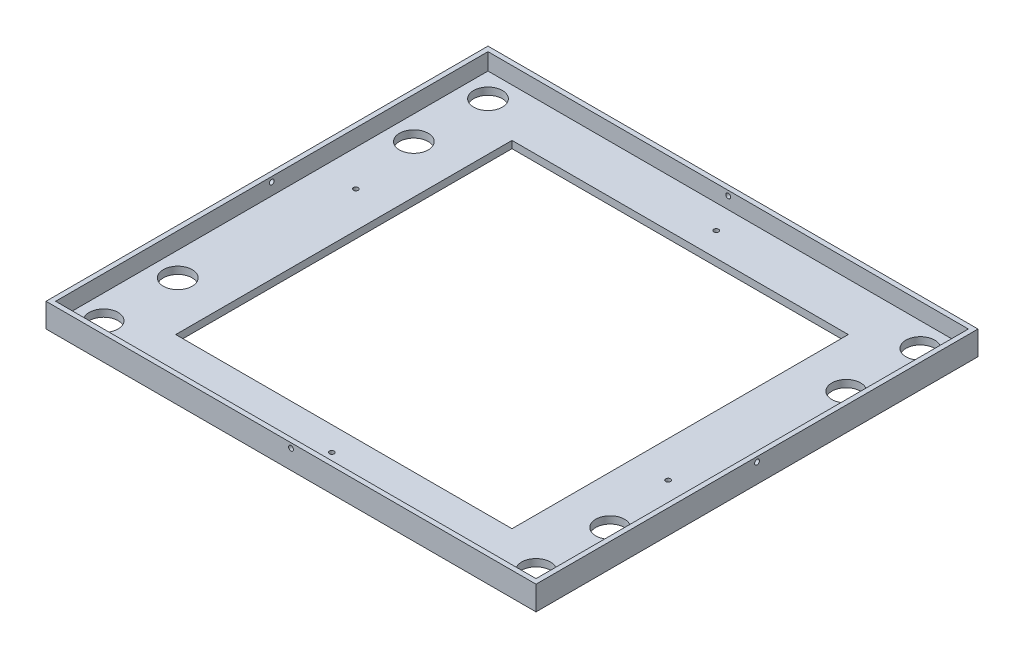
ISO-10303-21;
HEADER;
FILE_DESCRIPTION(('STEP AP214'),'2;1');
FILE_NAME('part.step','',(''),(''),'','','');
FILE_SCHEMA(('AUTOMOTIVE_DESIGN { 1 0 10303 214 1 1 1 1 }'));
ENDSEC;
DATA;
#1=APPLICATION_CONTEXT('core data for automotive mechanical design processes');
#2=APPLICATION_PROTOCOL_DEFINITION('international standard','automotive_design',2000,#1);
#3=PRODUCT_CONTEXT('',#1,'mechanical');
#4=PRODUCT('Part','Part','',(#3));
#5=PRODUCT_RELATED_PRODUCT_CATEGORY('part','',(#4));
#6=PRODUCT_DEFINITION_FORMATION('','',#4);
#7=PRODUCT_DEFINITION_CONTEXT('part definition',#1,'design');
#8=PRODUCT_DEFINITION('design','',#6,#7);
#9=PRODUCT_DEFINITION_SHAPE('','',#8);
#10=(LENGTH_UNIT() NAMED_UNIT(*) SI_UNIT(.MILLI.,.METRE.));
#11=(NAMED_UNIT(*) PLANE_ANGLE_UNIT() SI_UNIT($,.RADIAN.));
#12=(NAMED_UNIT(*) SI_UNIT($,.STERADIAN.) SOLID_ANGLE_UNIT());
#13=UNCERTAINTY_MEASURE_WITH_UNIT(LENGTH_MEASURE(1.E-05),#10,'distance_accuracy_value','');
#14=(GEOMETRIC_REPRESENTATION_CONTEXT(3) GLOBAL_UNCERTAINTY_ASSIGNED_CONTEXT((#13)) GLOBAL_UNIT_ASSIGNED_CONTEXT((#10,
#11,#12)) REPRESENTATION_CONTEXT('',''));
#15=CARTESIAN_POINT('',(0.,0.,0.));
#16=DIRECTION('',(0.,0.,1.));
#17=DIRECTION('',(1.,0.,0.));
#18=AXIS2_PLACEMENT_3D('',#15,#16,#17);
#19=CARTESIAN_POINT('',(0.,3.,-70.));
#20=DIRECTION('',(0.,0.,-1.));
#21=DIRECTION('',(-1.,0.,0.));
#22=AXIS2_PLACEMENT_3D('',#19,#20,#21);
#23=PLANE('',#22);
#24=DIRECTION('',(1.,0.,0.));
#25=VECTOR('',#24,1.);
#26=CARTESIAN_POINT('',(0.,0.,-70.));
#27=LINE('',#26,#25);
#28=CARTESIAN_POINT('',(-70.,0.,-70.));
#29=VERTEX_POINT('',#28);
#30=CARTESIAN_POINT('',(70.,0.,-70.));
#31=VERTEX_POINT('',#30);
#32=EDGE_CURVE('E183',#29,#31,#27,.T.);
#33=ORIENTED_EDGE('',*,*,#32,.T.);
#34=DIRECTION('',(0.,-1.,0.));
#35=VECTOR('',#34,1.);
#36=CARTESIAN_POINT('',(70.,3.,-70.));
#37=LINE('',#36,#35);
#38=CARTESIAN_POINT('',(70.,3.,-70.));
#39=VERTEX_POINT('',#38);
#40=EDGE_CURVE('E11',#39,#31,#37,.T.);
#41=ORIENTED_EDGE('',*,*,#40,.F.);
#42=DIRECTION('',(1.,0.,0.));
#43=VECTOR('',#42,1.);
#44=CARTESIAN_POINT('',(0.,3.,-70.));
#45=LINE('',#44,#43);
#46=CARTESIAN_POINT('',(-70.,3.,-70.));
#47=VERTEX_POINT('',#46);
#48=EDGE_CURVE('E219',#47,#39,#45,.T.);
#49=ORIENTED_EDGE('',*,*,#48,.F.);
#50=DIRECTION('',(0.,-1.,0.));
#51=VECTOR('',#50,1.);
#52=CARTESIAN_POINT('',(-70.,3.,-70.));
#53=LINE('',#52,#51);
#54=EDGE_CURVE('E83',#47,#29,#53,.T.);
#55=ORIENTED_EDGE('',*,*,#54,.T.);
#56=EDGE_LOOP('',(#33,#41,#49,#55));
#57=FACE_BOUND('',#56,.T.);
#58=ADVANCED_FACE('F39',(#57),#23,.F.);
#59=CARTESIAN_POINT('',(70.,3.,0.));
#60=DIRECTION('',(1.,0.,0.));
#61=DIRECTION('',(0.,0.,-1.));
#62=AXIS2_PLACEMENT_3D('',#59,#60,#61);
#63=PLANE('',#62);
#64=DIRECTION('',(0.,0.,1.));
#65=VECTOR('',#64,1.);
#66=CARTESIAN_POINT('',(70.,0.,0.));
#67=LINE('',#66,#65);
#68=CARTESIAN_POINT('',(70.,0.,70.));
#69=VERTEX_POINT('',#68);
#70=EDGE_CURVE('E186',#31,#69,#67,.T.);
#71=ORIENTED_EDGE('',*,*,#70,.T.);
#72=DIRECTION('',(0.,-1.,0.));
#73=VECTOR('',#72,1.);
#74=CARTESIAN_POINT('',(70.,3.,70.));
#75=LINE('',#74,#73);
#76=CARTESIAN_POINT('',(70.,3.,70.));
#77=VERTEX_POINT('',#76);
#78=EDGE_CURVE('E49',#77,#69,#75,.T.);
#79=ORIENTED_EDGE('',*,*,#78,.F.);
#80=DIRECTION('',(0.,0.,1.));
#81=VECTOR('',#80,1.);
#82=CARTESIAN_POINT('',(70.,3.,0.));
#83=LINE('',#82,#81);
#84=EDGE_CURVE('E91',#39,#77,#83,.T.);
#85=ORIENTED_EDGE('',*,*,#84,.F.);
#86=ORIENTED_EDGE('',*,*,#40,.T.);
#87=EDGE_LOOP('',(#71,#79,#85,#86));
#88=FACE_BOUND('',#87,.T.);
#89=ADVANCED_FACE('F214',(#88),#63,.F.);
#90=CARTESIAN_POINT('',(0.,3.,70.));
#91=DIRECTION('',(0.,0.,-1.));
#92=DIRECTION('',(-1.,0.,0.));
#93=AXIS2_PLACEMENT_3D('',#90,#91,#92);
#94=PLANE('',#93);
#95=DIRECTION('',(1.,0.,0.));
#96=VECTOR('',#95,1.);
#97=CARTESIAN_POINT('',(0.,0.,70.));
#98=LINE('',#97,#96);
#99=CARTESIAN_POINT('',(-70.,0.,70.));
#100=VERTEX_POINT('',#99);
#101=EDGE_CURVE('E102',#100,#69,#98,.T.);
#102=ORIENTED_EDGE('',*,*,#101,.F.);
#103=DIRECTION('',(0.,-1.,0.));
#104=VECTOR('',#103,1.);
#105=CARTESIAN_POINT('',(-70.,3.,70.));
#106=LINE('',#105,#104);
#107=CARTESIAN_POINT('',(-70.,3.,70.));
#108=VERTEX_POINT('',#107);
#109=EDGE_CURVE('E76',#108,#100,#106,.T.);
#110=ORIENTED_EDGE('',*,*,#109,.F.);
#111=DIRECTION('',(1.,0.,0.));
#112=VECTOR('',#111,1.);
#113=CARTESIAN_POINT('',(0.,3.,70.));
#114=LINE('',#113,#112);
#115=EDGE_CURVE('E100',#108,#77,#114,.T.);
#116=ORIENTED_EDGE('',*,*,#115,.T.);
#117=ORIENTED_EDGE('',*,*,#78,.T.);
#118=EDGE_LOOP('',(#102,#110,#116,#117));
#119=FACE_BOUND('',#118,.T.);
#120=ADVANCED_FACE('F99',(#119),#94,.T.);
#121=CARTESIAN_POINT('',(-90.,3.,49.1460267479901));
#122=DIRECTION('',(0.,-1.,0.));
#123=DIRECTION('',(0.,0.,-1.));
#124=AXIS2_PLACEMENT_3D('',#121,#122,#123);
#125=CYLINDRICAL_SURFACE('',#124,6.);
#126=CARTESIAN_POINT('',(-90.,3.,49.1460267479901));
#127=DIRECTION('',(0.,1.,0.));
#128=DIRECTION('',(0.,0.,1.));
#129=AXIS2_PLACEMENT_3D('',#126,#127,#128);
#130=CIRCLE('',#129,6.);
#131=CARTESIAN_POINT('',(-90.,3.,55.1460267479901));
#132=VERTEX_POINT('',#131);
#133=EDGE_CURVE('E142',#132,#132,#130,.F.);
#134=ORIENTED_EDGE('',*,*,#133,.F.);
#135=EDGE_LOOP('',(#134));
#136=FACE_BOUND('',#135,.T.);
#137=CARTESIAN_POINT('',(-90.,0.,49.1460267479901));
#138=DIRECTION('',(0.,1.,0.));
#139=DIRECTION('',(0.,0.,1.));
#140=AXIS2_PLACEMENT_3D('',#137,#138,#139);
#141=CIRCLE('',#140,6.);
#142=CARTESIAN_POINT('',(-90.,0.,55.1460267479901));
#143=VERTEX_POINT('',#142);
#144=EDGE_CURVE('E203',#143,#143,#141,.F.);
#145=ORIENTED_EDGE('',*,*,#144,.T.);
#146=EDGE_LOOP('',(#145));
#147=FACE_BOUND('',#146,.T.);
#148=ADVANCED_FACE('F536',(#136,#147),#125,.F.);
#149=CARTESIAN_POINT('',(5.00000000000003,3.,80.));
#150=DIRECTION('',(0.,-1.,0.));
#151=DIRECTION('',(0.,0.,-1.));
#152=AXIS2_PLACEMENT_3D('',#149,#150,#151);
#153=CYLINDRICAL_SURFACE('',#152,1.);
#154=CARTESIAN_POINT('',(5.00000000000003,3.,80.));
#155=DIRECTION('',(0.,1.,0.));
#156=DIRECTION('',(0.,0.,1.));
#157=AXIS2_PLACEMENT_3D('',#154,#155,#156);
#158=CIRCLE('',#157,1.);
#159=CARTESIAN_POINT('',(5.00000000000003,3.,81.));
#160=VERTEX_POINT('',#159);
#161=EDGE_CURVE('E138',#160,#160,#158,.F.);
#162=ORIENTED_EDGE('',*,*,#161,.F.);
#163=EDGE_LOOP('',(#162));
#164=FACE_BOUND('',#163,.T.);
#165=CARTESIAN_POINT('',(5.00000000000003,0.,80.));
#166=DIRECTION('',(0.,1.,0.));
#167=DIRECTION('',(0.,0.,1.));
#168=AXIS2_PLACEMENT_3D('',#165,#166,#167);
#169=CIRCLE('',#168,1.);
#170=CARTESIAN_POINT('',(5.00000000000003,0.,81.));
#171=VERTEX_POINT('',#170);
#172=EDGE_CURVE('E199',#171,#171,#169,.F.);
#173=ORIENTED_EDGE('',*,*,#172,.T.);
#174=EDGE_LOOP('',(#173));
#175=FACE_BOUND('',#174,.T.);
#176=ADVANCED_FACE('F539',(#164,#175),#153,.F.);
#177=CARTESIAN_POINT('',(5.00000000000003,3.,-80.));
#178=DIRECTION('',(0.,-1.,0.));
#179=DIRECTION('',(0.,0.,-1.));
#180=AXIS2_PLACEMENT_3D('',#177,#178,#179);
#181=CYLINDRICAL_SURFACE('',#180,1.);
#182=CARTESIAN_POINT('',(5.00000000000003,3.,-80.));
#183=DIRECTION('',(0.,1.,0.));
#184=DIRECTION('',(0.,0.,1.));
#185=AXIS2_PLACEMENT_3D('',#182,#183,#184);
#186=CIRCLE('',#185,1.);
#187=CARTESIAN_POINT('',(5.00000000000003,3.,-79.));
#188=VERTEX_POINT('',#187);
#189=EDGE_CURVE('E134',#188,#188,#186,.T.);
#190=ORIENTED_EDGE('',*,*,#189,.T.);
#191=EDGE_LOOP('',(#190));
#192=FACE_BOUND('',#191,.T.);
#193=CARTESIAN_POINT('',(5.00000000000003,0.,-80.));
#194=DIRECTION('',(0.,1.,0.));
#195=DIRECTION('',(0.,0.,1.));
#196=AXIS2_PLACEMENT_3D('',#193,#194,#195);
#197=CIRCLE('',#196,1.);
#198=CARTESIAN_POINT('',(5.00000000000003,0.,-79.));
#199=VERTEX_POINT('',#198);
#200=EDGE_CURVE('E195',#199,#199,#197,.T.);
#201=ORIENTED_EDGE('',*,*,#200,.F.);
#202=EDGE_LOOP('',(#201));
#203=FACE_BOUND('',#202,.T.);
#204=ADVANCED_FACE('F543',(#192,#203),#181,.F.);
#205=CARTESIAN_POINT('',(-70.,3.,0.));
#206=DIRECTION('',(1.,0.,0.));
#207=DIRECTION('',(0.,0.,-1.));
#208=AXIS2_PLACEMENT_3D('',#205,#206,#207);
#209=PLANE('',#208);
#210=DIRECTION('',(0.,0.,1.));
#211=VECTOR('',#210,1.);
#212=CARTESIAN_POINT('',(-70.,0.,0.));
#213=LINE('',#212,#211);
#214=EDGE_CURVE('E192',#29,#100,#213,.T.);
#215=ORIENTED_EDGE('',*,*,#214,.F.);
#216=ORIENTED_EDGE('',*,*,#54,.F.);
#217=DIRECTION('',(0.,0.,1.));
#218=VECTOR('',#217,1.);
#219=CARTESIAN_POINT('',(-70.,3.,0.));
#220=LINE('',#219,#218);
#221=EDGE_CURVE('E110',#47,#108,#220,.T.);
#222=ORIENTED_EDGE('',*,*,#221,.T.);
#223=ORIENTED_EDGE('',*,*,#109,.T.);
#224=EDGE_LOOP('',(#215,#216,#222,#223));
#225=FACE_BOUND('',#224,.T.);
#226=ADVANCED_FACE('F113',(#225),#209,.T.);
#227=CARTESIAN_POINT('',(-85.,3.,-20.));
#228=DIRECTION('',(0.,-1.,0.));
#229=DIRECTION('',(0.,0.,-1.));
#230=AXIS2_PLACEMENT_3D('',#227,#228,#229);
#231=CYLINDRICAL_SURFACE('',#230,0.999999999999998);
#232=CARTESIAN_POINT('',(-85.,3.,-20.));
#233=DIRECTION('',(0.,1.,0.));
#234=DIRECTION('',(0.,0.,1.));
#235=AXIS2_PLACEMENT_3D('',#232,#233,#234);
#236=CIRCLE('',#235,0.999999999999998);
#237=CARTESIAN_POINT('',(-85.,3.,-19.));
#238=VERTEX_POINT('',#237);
#239=EDGE_CURVE('E221',#238,#238,#236,.T.);
#240=ORIENTED_EDGE('',*,*,#239,.T.);
#241=EDGE_LOOP('',(#240));
#242=FACE_BOUND('',#241,.T.);
#243=CARTESIAN_POINT('',(-85.,0.,-20.));
#244=DIRECTION('',(0.,1.,0.));
#245=DIRECTION('',(0.,0.,1.));
#246=AXIS2_PLACEMENT_3D('',#243,#244,#245);
#247=CIRCLE('',#246,0.999999999999998);
#248=CARTESIAN_POINT('',(-85.,0.,-19.));
#249=VERTEX_POINT('',#248);
#250=EDGE_CURVE('E179',#249,#249,#247,.T.);
#251=ORIENTED_EDGE('',*,*,#250,.F.);
#252=EDGE_LOOP('',(#251));
#253=FACE_BOUND('',#252,.T.);
#254=ADVANCED_FACE('F458',(#242,#253),#231,.F.);
#255=CARTESIAN_POINT('',(-90.,3.,-80.));
#256=DIRECTION('',(0.,-1.,0.));
#257=DIRECTION('',(0.,0.,-1.));
#258=AXIS2_PLACEMENT_3D('',#255,#256,#257);
#259=CYLINDRICAL_SURFACE('',#258,6.);
#260=CARTESIAN_POINT('',(-90.,3.,-80.));
#261=DIRECTION('',(0.,1.,0.));
#262=DIRECTION('',(0.,0.,1.));
#263=AXIS2_PLACEMENT_3D('',#260,#261,#262);
#264=CIRCLE('',#263,6.);
#265=CARTESIAN_POINT('',(-90.,3.,-74.));
#266=VERTEX_POINT('',#265);
#267=EDGE_CURVE('E226',#266,#266,#264,.T.);
#268=ORIENTED_EDGE('',*,*,#267,.T.);
#269=EDGE_LOOP('',(#268));
#270=FACE_BOUND('',#269,.T.);
#271=CARTESIAN_POINT('',(-90.,0.,-80.));
#272=DIRECTION('',(0.,1.,0.));
#273=DIRECTION('',(0.,0.,1.));
#274=AXIS2_PLACEMENT_3D('',#271,#272,#273);
#275=CIRCLE('',#274,6.);
#276=CARTESIAN_POINT('',(-90.,0.,-74.));
#277=VERTEX_POINT('',#276);
#278=EDGE_CURVE('E175',#277,#277,#275,.T.);
#279=ORIENTED_EDGE('',*,*,#278,.F.);
#280=EDGE_LOOP('',(#279));
#281=FACE_BOUND('',#280,.T.);
#282=ADVANCED_FACE('F461',(#270,#281),#259,.F.);
#283=CARTESIAN_POINT('',(-90.,3.,-49.1460267479901));
#284=DIRECTION('',(0.,-1.,0.));
#285=DIRECTION('',(0.,0.,-1.));
#286=AXIS2_PLACEMENT_3D('',#283,#284,#285);
#287=CYLINDRICAL_SURFACE('',#286,6.);
#288=CARTESIAN_POINT('',(-90.,3.,-49.1460267479901));
#289=DIRECTION('',(0.,1.,0.));
#290=DIRECTION('',(0.,0.,1.));
#291=AXIS2_PLACEMENT_3D('',#288,#289,#290);
#292=CIRCLE('',#291,6.);
#293=CARTESIAN_POINT('',(-90.,3.,-43.1460267479901));
#294=VERTEX_POINT('',#293);
#295=EDGE_CURVE('E232',#294,#294,#292,.T.);
#296=ORIENTED_EDGE('',*,*,#295,.T.);
#297=EDGE_LOOP('',(#296));
#298=FACE_BOUND('',#297,.T.);
#299=CARTESIAN_POINT('',(-90.,0.,-49.1460267479901));
#300=DIRECTION('',(0.,1.,0.));
#301=DIRECTION('',(0.,0.,1.));
#302=AXIS2_PLACEMENT_3D('',#299,#300,#301);
#303=CIRCLE('',#302,6.);
#304=CARTESIAN_POINT('',(-90.,0.,-43.1460267479901));
#305=VERTEX_POINT('',#304);
#306=EDGE_CURVE('E171',#305,#305,#303,.T.);
#307=ORIENTED_EDGE('',*,*,#306,.F.);
#308=EDGE_LOOP('',(#307));
#309=FACE_BOUND('',#308,.T.);
#310=ADVANCED_FACE('F465',(#298,#309),#287,.F.);
#311=CARTESIAN_POINT('',(-90.,3.,80.));
#312=DIRECTION('',(0.,-1.,0.));
#313=DIRECTION('',(0.,0.,-1.));
#314=AXIS2_PLACEMENT_3D('',#311,#312,#313);
#315=CYLINDRICAL_SURFACE('',#314,6.);
#316=CARTESIAN_POINT('',(-90.,3.,80.));
#317=DIRECTION('',(0.,1.,0.));
#318=DIRECTION('',(0.,0.,1.));
#319=AXIS2_PLACEMENT_3D('',#316,#317,#318);
#320=CIRCLE('',#319,6.);
#321=CARTESIAN_POINT('',(-90.,3.,86.));
#322=VERTEX_POINT('',#321);
#323=EDGE_CURVE('E236',#322,#322,#320,.F.);
#324=ORIENTED_EDGE('',*,*,#323,.F.);
#325=EDGE_LOOP('',(#324));
#326=FACE_BOUND('',#325,.T.);
#327=CARTESIAN_POINT('',(-90.,0.,80.));
#328=DIRECTION('',(0.,1.,0.));
#329=DIRECTION('',(0.,0.,1.));
#330=AXIS2_PLACEMENT_3D('',#327,#328,#329);
#331=CIRCLE('',#330,6.);
#332=CARTESIAN_POINT('',(-90.,0.,86.));
#333=VERTEX_POINT('',#332);
#334=EDGE_CURVE('E167',#333,#333,#331,.F.);
#335=ORIENTED_EDGE('',*,*,#334,.T.);
#336=EDGE_LOOP('',(#335));
#337=FACE_BOUND('',#336,.T.);
#338=ADVANCED_FACE('F469',(#326,#337),#315,.F.);
#339=CARTESIAN_POINT('',(90.0000000000001,3.,80.));
#340=DIRECTION('',(0.,-1.,0.));
#341=DIRECTION('',(0.,0.,-1.));
#342=AXIS2_PLACEMENT_3D('',#339,#340,#341);
#343=CYLINDRICAL_SURFACE('',#342,6.);
#344=CARTESIAN_POINT('',(90.0000000000001,3.,80.));
#345=DIRECTION('',(0.,1.,0.));
#346=DIRECTION('',(0.,0.,1.));
#347=AXIS2_PLACEMENT_3D('',#344,#345,#346);
#348=CIRCLE('',#347,6.);
#349=CARTESIAN_POINT('',(90.0000000000001,3.,86.));
#350=VERTEX_POINT('',#349);
#351=EDGE_CURVE('E240',#350,#350,#348,.T.);
#352=ORIENTED_EDGE('',*,*,#351,.T.);
#353=EDGE_LOOP('',(#352));
#354=FACE_BOUND('',#353,.T.);
#355=CARTESIAN_POINT('',(90.0000000000001,0.,80.));
#356=DIRECTION('',(0.,1.,0.));
#357=DIRECTION('',(0.,0.,1.));
#358=AXIS2_PLACEMENT_3D('',#355,#356,#357);
#359=CIRCLE('',#358,6.);
#360=CARTESIAN_POINT('',(90.0000000000001,0.,86.));
#361=VERTEX_POINT('',#360);
#362=EDGE_CURVE('E163',#361,#361,#359,.T.);
#363=ORIENTED_EDGE('',*,*,#362,.F.);
#364=EDGE_LOOP('',(#363));
#365=FACE_BOUND('',#364,.T.);
#366=ADVANCED_FACE('F473',(#354,#365),#343,.F.);
#367=CARTESIAN_POINT('',(90.0000000000001,3.,49.1460267479901));
#368=DIRECTION('',(0.,-1.,0.));
#369=DIRECTION('',(0.,0.,-1.));
#370=AXIS2_PLACEMENT_3D('',#367,#368,#369);
#371=CYLINDRICAL_SURFACE('',#370,6.);
#372=CARTESIAN_POINT('',(90.0000000000001,3.,49.1460267479901));
#373=DIRECTION('',(0.,1.,0.));
#374=DIRECTION('',(0.,0.,1.));
#375=AXIS2_PLACEMENT_3D('',#372,#373,#374);
#376=CIRCLE('',#375,6.);
#377=CARTESIAN_POINT('',(90.0000000000001,3.,55.1460267479901));
#378=VERTEX_POINT('',#377);
#379=EDGE_CURVE('E244',#378,#378,#376,.T.);
#380=ORIENTED_EDGE('',*,*,#379,.T.);
#381=EDGE_LOOP('',(#380));
#382=FACE_BOUND('',#381,.T.);
#383=CARTESIAN_POINT('',(90.0000000000001,0.,49.1460267479901));
#384=DIRECTION('',(0.,1.,0.));
#385=DIRECTION('',(0.,0.,1.));
#386=AXIS2_PLACEMENT_3D('',#383,#384,#385);
#387=CIRCLE('',#386,6.);
#388=CARTESIAN_POINT('',(90.0000000000001,0.,55.1460267479901));
#389=VERTEX_POINT('',#388);
#390=EDGE_CURVE('E159',#389,#389,#387,.T.);
#391=ORIENTED_EDGE('',*,*,#390,.F.);
#392=EDGE_LOOP('',(#391));
#393=FACE_BOUND('',#392,.T.);
#394=ADVANCED_FACE('F477',(#382,#393),#371,.F.);
#395=CARTESIAN_POINT('',(90.,3.,-49.1460267479901));
#396=DIRECTION('',(0.,-1.,0.));
#397=DIRECTION('',(0.,0.,-1.));
#398=AXIS2_PLACEMENT_3D('',#395,#396,#397);
#399=CYLINDRICAL_SURFACE('',#398,6.);
#400=CARTESIAN_POINT('',(90.,3.,-49.1460267479901));
#401=DIRECTION('',(0.,1.,0.));
#402=DIRECTION('',(0.,0.,1.));
#403=AXIS2_PLACEMENT_3D('',#400,#401,#402);
#404=CIRCLE('',#403,6.);
#405=CARTESIAN_POINT('',(90.,3.,-43.1460267479901));
#406=VERTEX_POINT('',#405);
#407=EDGE_CURVE('E248',#406,#406,#404,.F.);
#408=ORIENTED_EDGE('',*,*,#407,.F.);
#409=EDGE_LOOP('',(#408));
#410=FACE_BOUND('',#409,.T.);
#411=CARTESIAN_POINT('',(90.,0.,-49.1460267479901));
#412=DIRECTION('',(0.,1.,0.));
#413=DIRECTION('',(0.,0.,1.));
#414=AXIS2_PLACEMENT_3D('',#411,#412,#413);
#415=CIRCLE('',#414,6.);
#416=CARTESIAN_POINT('',(90.,0.,-43.1460267479901));
#417=VERTEX_POINT('',#416);
#418=EDGE_CURVE('E154',#417,#417,#415,.F.);
#419=ORIENTED_EDGE('',*,*,#418,.T.);
#420=EDGE_LOOP('',(#419));
#421=FACE_BOUND('',#420,.T.);
#422=ADVANCED_FACE('F480',(#410,#421),#399,.F.);
#423=CARTESIAN_POINT('',(85.,3.,20.));
#424=DIRECTION('',(0.,-1.,0.));
#425=DIRECTION('',(0.,0.,-1.));
#426=AXIS2_PLACEMENT_3D('',#423,#424,#425);
#427=CYLINDRICAL_SURFACE('',#426,0.999999999999998);
#428=CARTESIAN_POINT('',(85.,3.,20.));
#429=DIRECTION('',(0.,1.,0.));
#430=DIRECTION('',(0.,0.,1.));
#431=AXIS2_PLACEMENT_3D('',#428,#429,#430);
#432=CIRCLE('',#431,0.999999999999998);
#433=CARTESIAN_POINT('',(85.,3.,21.));
#434=VERTEX_POINT('',#433);
#435=EDGE_CURVE('E211',#434,#434,#432,.T.);
#436=ORIENTED_EDGE('',*,*,#435,.T.);
#437=EDGE_LOOP('',(#436));
#438=FACE_BOUND('',#437,.T.);
#439=CARTESIAN_POINT('',(85.,0.,20.));
#440=DIRECTION('',(0.,1.,0.));
#441=DIRECTION('',(0.,0.,1.));
#442=AXIS2_PLACEMENT_3D('',#439,#440,#441);
#443=CIRCLE('',#442,0.999999999999998);
#444=CARTESIAN_POINT('',(85.,0.,21.));
#445=VERTEX_POINT('',#444);
#446=EDGE_CURVE('E150',#445,#445,#443,.T.);
#447=ORIENTED_EDGE('',*,*,#446,.F.);
#448=EDGE_LOOP('',(#447));
#449=FACE_BOUND('',#448,.T.);
#450=ADVANCED_FACE('F41',(#438,#449),#427,.F.);
#451=CARTESIAN_POINT('',(90.,3.,-80.));
#452=DIRECTION('',(0.,-1.,0.));
#453=DIRECTION('',(0.,0.,-1.));
#454=AXIS2_PLACEMENT_3D('',#451,#452,#453);
#455=CYLINDRICAL_SURFACE('',#454,6.);
#456=CARTESIAN_POINT('',(90.,3.,-80.));
#457=DIRECTION('',(0.,1.,0.));
#458=DIRECTION('',(0.,0.,1.));
#459=AXIS2_PLACEMENT_3D('',#456,#457,#458);
#460=CIRCLE('',#459,6.);
#461=CARTESIAN_POINT('',(90.,3.,-74.));
#462=VERTEX_POINT('',#461);
#463=EDGE_CURVE('E146',#462,#462,#460,.F.);
#464=ORIENTED_EDGE('',*,*,#463,.F.);
#465=EDGE_LOOP('',(#464));
#466=FACE_BOUND('',#465,.T.);
#467=CARTESIAN_POINT('',(90.,0.,-80.));
#468=DIRECTION('',(0.,1.,0.));
#469=DIRECTION('',(0.,0.,1.));
#470=AXIS2_PLACEMENT_3D('',#467,#468,#469);
#471=CIRCLE('',#470,6.);
#472=CARTESIAN_POINT('',(90.,0.,-74.));
#473=VERTEX_POINT('',#472);
#474=EDGE_CURVE('E207',#473,#473,#471,.F.);
#475=ORIENTED_EDGE('',*,*,#474,.T.);
#476=EDGE_LOOP('',(#475));
#477=FACE_BOUND('',#476,.T.);
#478=ADVANCED_FACE('F487',(#466,#477),#455,.F.);
#479=CARTESIAN_POINT('',(0.,3.,0.));
#480=DIRECTION('',(0.,1.,0.));
#481=DIRECTION('',(0.,0.,1.));
#482=AXIS2_PLACEMENT_3D('',#479,#480,#481);
#483=PLANE('',#482);
#484=ORIENTED_EDGE('',*,*,#435,.F.);
#485=EDGE_LOOP('',(#484));
#486=FACE_BOUND('',#485,.T.);
#487=ORIENTED_EDGE('',*,*,#407,.T.);
#488=EDGE_LOOP('',(#487));
#489=FACE_BOUND('',#488,.T.);
#490=ORIENTED_EDGE('',*,*,#379,.F.);
#491=EDGE_LOOP('',(#490));
#492=FACE_BOUND('',#491,.T.);
#493=ORIENTED_EDGE('',*,*,#351,.F.);
#494=EDGE_LOOP('',(#493));
#495=FACE_BOUND('',#494,.T.);
#496=ORIENTED_EDGE('',*,*,#323,.T.);
#497=EDGE_LOOP('',(#496));
#498=FACE_BOUND('',#497,.T.);
#499=ORIENTED_EDGE('',*,*,#295,.F.);
#500=EDGE_LOOP('',(#499));
#501=FACE_BOUND('',#500,.T.);
#502=ORIENTED_EDGE('',*,*,#267,.F.);
#503=EDGE_LOOP('',(#502));
#504=FACE_BOUND('',#503,.T.);
#505=ORIENTED_EDGE('',*,*,#239,.F.);
#506=EDGE_LOOP('',(#505));
#507=FACE_BOUND('',#506,.T.);
#508=ORIENTED_EDGE('',*,*,#48,.T.);
#509=ORIENTED_EDGE('',*,*,#84,.T.);
#510=ORIENTED_EDGE('',*,*,#115,.F.);
#511=ORIENTED_EDGE('',*,*,#221,.F.);
#512=EDGE_LOOP('',(#508,#509,#510,#511));
#513=FACE_BOUND('',#512,.T.);
#514=DIRECTION('',(0.,0.,1.));
#515=VECTOR('',#514,1.);
#516=CARTESIAN_POINT('',(100.,3.,0.));
#517=LINE('',#516,#515);
#518=CARTESIAN_POINT('',(100.,3.,-90.));
#519=VERTEX_POINT('',#518);
#520=CARTESIAN_POINT('',(100.,3.,90.));
#521=VERTEX_POINT('',#520);
#522=EDGE_CURVE('E115',#519,#521,#517,.T.);
#523=ORIENTED_EDGE('',*,*,#522,.F.);
#524=DIRECTION('',(1.,0.,0.));
#525=VECTOR('',#524,1.);
#526=CARTESIAN_POINT('',(0.,3.,-90.));
#527=LINE('',#526,#525);
#528=CARTESIAN_POINT('',(-100.,3.,-90.));
#529=VERTEX_POINT('',#528);
#530=EDGE_CURVE('E119',#529,#519,#527,.T.);
#531=ORIENTED_EDGE('',*,*,#530,.F.);
#532=DIRECTION('',(0.,0.,1.));
#533=VECTOR('',#532,1.);
#534=CARTESIAN_POINT('',(-100.,3.,0.));
#535=LINE('',#534,#533);
#536=CARTESIAN_POINT('',(-100.,3.,90.));
#537=VERTEX_POINT('',#536);
#538=EDGE_CURVE('E126',#529,#537,#535,.T.);
#539=ORIENTED_EDGE('',*,*,#538,.T.);
#540=DIRECTION('',(1.,0.,0.));
#541=VECTOR('',#540,1.);
#542=CARTESIAN_POINT('',(0.,3.,90.));
#543=LINE('',#542,#541);
#544=EDGE_CURVE('E130',#537,#521,#543,.T.);
#545=ORIENTED_EDGE('',*,*,#544,.T.);
#546=EDGE_LOOP('',(#523,#531,#539,#545));
#547=FACE_BOUND('',#546,.T.);
#548=ORIENTED_EDGE('',*,*,#189,.F.);
#549=EDGE_LOOP('',(#548));
#550=FACE_BOUND('',#549,.T.);
#551=ORIENTED_EDGE('',*,*,#161,.T.);
#552=EDGE_LOOP('',(#551));
#553=FACE_BOUND('',#552,.T.);
#554=ORIENTED_EDGE('',*,*,#133,.T.);
#555=EDGE_LOOP('',(#554));
#556=FACE_BOUND('',#555,.T.);
#557=ORIENTED_EDGE('',*,*,#463,.T.);
#558=EDGE_LOOP('',(#557));
#559=FACE_BOUND('',#558,.T.);
#560=ADVANCED_FACE('F108',(#486,#489,#492,#495,#498,#501,#504,#507,#513,#547,#550,#553,#556,
#559),#483,.T.);
#561=CARTESIAN_POINT('',(0.,0.,0.));
#562=DIRECTION('',(0.,1.,0.));
#563=DIRECTION('',(0.,0.,1.));
#564=AXIS2_PLACEMENT_3D('',#561,#562,#563);
#565=PLANE('',#564);
#566=ORIENTED_EDGE('',*,*,#446,.T.);
#567=EDGE_LOOP('',(#566));
#568=FACE_BOUND('',#567,.T.);
#569=ORIENTED_EDGE('',*,*,#418,.F.);
#570=EDGE_LOOP('',(#569));
#571=FACE_BOUND('',#570,.T.);
#572=ORIENTED_EDGE('',*,*,#390,.T.);
#573=EDGE_LOOP('',(#572));
#574=FACE_BOUND('',#573,.T.);
#575=ORIENTED_EDGE('',*,*,#362,.T.);
#576=EDGE_LOOP('',(#575));
#577=FACE_BOUND('',#576,.T.);
#578=ORIENTED_EDGE('',*,*,#334,.F.);
#579=EDGE_LOOP('',(#578));
#580=FACE_BOUND('',#579,.T.);
#581=ORIENTED_EDGE('',*,*,#306,.T.);
#582=EDGE_LOOP('',(#581));
#583=FACE_BOUND('',#582,.T.);
#584=ORIENTED_EDGE('',*,*,#278,.T.);
#585=EDGE_LOOP('',(#584));
#586=FACE_BOUND('',#585,.T.);
#587=ORIENTED_EDGE('',*,*,#250,.T.);
#588=EDGE_LOOP('',(#587));
#589=FACE_BOUND('',#588,.T.);
#590=ORIENTED_EDGE('',*,*,#32,.F.);
#591=ORIENTED_EDGE('',*,*,#214,.T.);
#592=ORIENTED_EDGE('',*,*,#101,.T.);
#593=ORIENTED_EDGE('',*,*,#70,.F.);
#594=EDGE_LOOP('',(#590,#591,#592,#593));
#595=FACE_BOUND('',#594,.T.);
#596=ORIENTED_EDGE('',*,*,#200,.T.);
#597=EDGE_LOOP('',(#596));
#598=FACE_BOUND('',#597,.T.);
#599=ORIENTED_EDGE('',*,*,#172,.F.);
#600=EDGE_LOOP('',(#599));
#601=FACE_BOUND('',#600,.T.);
#602=ORIENTED_EDGE('',*,*,#144,.F.);
#603=EDGE_LOOP('',(#602));
#604=FACE_BOUND('',#603,.T.);
#605=ORIENTED_EDGE('',*,*,#474,.F.);
#606=EDGE_LOOP('',(#605));
#607=FACE_BOUND('',#606,.T.);
#608=DIRECTION('',(-1.,0.,0.));
#609=VECTOR('',#608,1.);
#610=CARTESIAN_POINT('',(0.,0.,-92.));
#611=LINE('',#610,#609);
#612=CARTESIAN_POINT('',(102.,0.,-92.));
#613=VERTEX_POINT('',#612);
#614=CARTESIAN_POINT('',(-102.,0.,-92.));
#615=VERTEX_POINT('',#614);
#616=EDGE_CURVE('E298',#613,#615,#611,.T.);
#617=ORIENTED_EDGE('',*,*,#616,.F.);
#618=DIRECTION('',(0.,0.,1.));
#619=VECTOR('',#618,1.);
#620=CARTESIAN_POINT('',(102.,0.,0.));
#621=LINE('',#620,#619);
#622=CARTESIAN_POINT('',(102.,0.,92.));
#623=VERTEX_POINT('',#622);
#624=EDGE_CURVE('E285',#613,#623,#621,.T.);
#625=ORIENTED_EDGE('',*,*,#624,.T.);
#626=DIRECTION('',(-1.,0.,0.));
#627=VECTOR('',#626,1.);
#628=CARTESIAN_POINT('',(0.,0.,92.));
#629=LINE('',#628,#627);
#630=CARTESIAN_POINT('',(-102.,0.,92.));
#631=VERTEX_POINT('',#630);
#632=EDGE_CURVE('E290',#623,#631,#629,.T.);
#633=ORIENTED_EDGE('',*,*,#632,.T.);
#634=DIRECTION('',(0.,0.,1.));
#635=VECTOR('',#634,1.);
#636=CARTESIAN_POINT('',(-102.,0.,0.));
#637=LINE('',#636,#635);
#638=EDGE_CURVE('E294',#615,#631,#637,.T.);
#639=ORIENTED_EDGE('',*,*,#638,.F.);
#640=EDGE_LOOP('',(#617,#625,#633,#639));
#641=FACE_BOUND('',#640,.T.);
#642=ADVANCED_FACE('F217',(#568,#571,#574,#577,#580,#583,#586,#589,#595,#598,#601,#604,#607,
#641),#565,.F.);
#643=CARTESIAN_POINT('',(0.,10.,-92.));
#644=DIRECTION('',(0.,0.,1.));
#645=DIRECTION('',(1.,0.,0.));
#646=AXIS2_PLACEMENT_3D('',#643,#644,#645);
#647=PLANE('',#646);
#648=CARTESIAN_POINT('',(0.,8.,-92.));
#649=DIRECTION('',(0.,0.,-1.));
#650=DIRECTION('',(-1.,0.,0.));
#651=AXIS2_PLACEMENT_3D('',#648,#649,#650);
#652=CIRCLE('',#651,1.);
#653=CARTESIAN_POINT('',(-0.999999999999971,8.,-92.));
#654=VERTEX_POINT('',#653);
#655=EDGE_CURVE('E340',#654,#654,#652,.T.);
#656=ORIENTED_EDGE('',*,*,#655,.F.);
#657=EDGE_LOOP('',(#656));
#658=FACE_BOUND('',#657,.T.);
#659=ORIENTED_EDGE('',*,*,#616,.T.);
#660=DIRECTION('',(0.,-1.,0.));
#661=VECTOR('',#660,1.);
#662=CARTESIAN_POINT('',(-102.,10.,-92.));
#663=LINE('',#662,#661);
#664=CARTESIAN_POINT('',(-102.,10.,-92.));
#665=VERTEX_POINT('',#664);
#666=EDGE_CURVE('E155',#665,#615,#663,.T.);
#667=ORIENTED_EDGE('',*,*,#666,.F.);
#668=DIRECTION('',(-1.,0.,0.));
#669=VECTOR('',#668,1.);
#670=CARTESIAN_POINT('',(0.,10.,-92.));
#671=LINE('',#670,#669);
#672=CARTESIAN_POINT('',(102.,10.,-92.));
#673=VERTEX_POINT('',#672);
#674=EDGE_CURVE('E314',#673,#665,#671,.T.);
#675=ORIENTED_EDGE('',*,*,#674,.F.);
#676=DIRECTION('',(0.,-1.,0.));
#677=VECTOR('',#676,1.);
#678=CARTESIAN_POINT('',(102.,10.,-92.));
#679=LINE('',#678,#677);
#680=EDGE_CURVE('E259',#673,#613,#679,.T.);
#681=ORIENTED_EDGE('',*,*,#680,.T.);
#682=EDGE_LOOP('',(#659,#667,#675,#681));
#683=FACE_BOUND('',#682,.T.);
#684=ADVANCED_FACE('F436',(#658,#683),#647,.F.);
#685=CARTESIAN_POINT('',(-102.,10.,0.));
#686=DIRECTION('',(1.,0.,0.));
#687=DIRECTION('',(0.,0.,-1.));
#688=AXIS2_PLACEMENT_3D('',#685,#686,#687);
#689=PLANE('',#688);
#690=CARTESIAN_POINT('',(-102.,8.,0.));
#691=DIRECTION('',(-1.,0.,0.));
#692=DIRECTION('',(0.,0.,1.));
#693=AXIS2_PLACEMENT_3D('',#690,#691,#692);
#694=CIRCLE('',#693,1.);
#695=CARTESIAN_POINT('',(-102.,8.,1.00000000000002));
#696=VERTEX_POINT('',#695);
#697=EDGE_CURVE('E332',#696,#696,#694,.T.);
#698=ORIENTED_EDGE('',*,*,#697,.F.);
#699=EDGE_LOOP('',(#698));
#700=FACE_BOUND('',#699,.T.);
#701=ORIENTED_EDGE('',*,*,#638,.T.);
#702=DIRECTION('',(0.,-1.,0.));
#703=VECTOR('',#702,1.);
#704=CARTESIAN_POINT('',(-102.,10.,92.));
#705=LINE('',#704,#703);
#706=CARTESIAN_POINT('',(-102.,10.,92.));
#707=VERTEX_POINT('',#706);
#708=EDGE_CURVE('E274',#707,#631,#705,.T.);
#709=ORIENTED_EDGE('',*,*,#708,.F.);
#710=DIRECTION('',(0.,0.,1.));
#711=VECTOR('',#710,1.);
#712=CARTESIAN_POINT('',(-102.,10.,0.));
#713=LINE('',#712,#711);
#714=EDGE_CURVE('E310',#665,#707,#713,.T.);
#715=ORIENTED_EDGE('',*,*,#714,.F.);
#716=ORIENTED_EDGE('',*,*,#666,.T.);
#717=EDGE_LOOP('',(#701,#709,#715,#716));
#718=FACE_BOUND('',#717,.T.);
#719=ADVANCED_FACE('F378',(#700,#718),#689,.F.);
#720=CARTESIAN_POINT('',(0.,10.,92.));
#721=DIRECTION('',(0.,0.,1.));
#722=DIRECTION('',(1.,0.,0.));
#723=AXIS2_PLACEMENT_3D('',#720,#721,#722);
#724=PLANE('',#723);
#725=CARTESIAN_POINT('',(0.,8.,92.));
#726=DIRECTION('',(0.,0.,1.));
#727=DIRECTION('',(1.,0.,0.));
#728=AXIS2_PLACEMENT_3D('',#725,#726,#727);
#729=CIRCLE('',#728,1.);
#730=CARTESIAN_POINT('',(1.,8.,92.));
#731=VERTEX_POINT('',#730);
#732=EDGE_CURVE('E356',#731,#731,#729,.T.);
#733=ORIENTED_EDGE('',*,*,#732,.F.);
#734=EDGE_LOOP('',(#733));
#735=FACE_BOUND('',#734,.T.);
#736=ORIENTED_EDGE('',*,*,#632,.F.);
#737=DIRECTION('',(0.,-1.,0.));
#738=VECTOR('',#737,1.);
#739=CARTESIAN_POINT('',(102.,10.,92.));
#740=LINE('',#739,#738);
#741=CARTESIAN_POINT('',(102.,10.,92.));
#742=VERTEX_POINT('',#741);
#743=EDGE_CURVE('E278',#742,#623,#740,.T.);
#744=ORIENTED_EDGE('',*,*,#743,.F.);
#745=DIRECTION('',(-1.,0.,0.));
#746=VECTOR('',#745,1.);
#747=CARTESIAN_POINT('',(0.,10.,92.));
#748=LINE('',#747,#746);
#749=EDGE_CURVE('E306',#742,#707,#748,.T.);
#750=ORIENTED_EDGE('',*,*,#749,.T.);
#751=ORIENTED_EDGE('',*,*,#708,.T.);
#752=EDGE_LOOP('',(#736,#744,#750,#751));
#753=FACE_BOUND('',#752,.T.);
#754=ADVANCED_FACE('F374',(#735,#753),#724,.T.);
#755=CARTESIAN_POINT('',(0.,10.,-90.));
#756=DIRECTION('',(0.,0.,-1.));
#757=DIRECTION('',(-1.,0.,0.));
#758=AXIS2_PLACEMENT_3D('',#755,#756,#757);
#759=PLANE('',#758);
#760=CARTESIAN_POINT('',(0.,8.,-90.));
#761=DIRECTION('',(0.,0.,-1.));
#762=DIRECTION('',(-1.,0.,0.));
#763=AXIS2_PLACEMENT_3D('',#760,#761,#762);
#764=CIRCLE('',#763,1.);
#765=CARTESIAN_POINT('',(-0.999999999999971,8.,-90.));
#766=VERTEX_POINT('',#765);
#767=EDGE_CURVE('E336',#766,#766,#764,.T.);
#768=ORIENTED_EDGE('',*,*,#767,.T.);
#769=EDGE_LOOP('',(#768));
#770=FACE_BOUND('',#769,.T.);
#771=ORIENTED_EDGE('',*,*,#530,.T.);
#772=DIRECTION('',(0.,-1.,0.));
#773=VECTOR('',#772,1.);
#774=CARTESIAN_POINT('',(100.,10.,-90.));
#775=LINE('',#774,#773);
#776=CARTESIAN_POINT('',(100.,10.,-90.));
#777=VERTEX_POINT('',#776);
#778=EDGE_CURVE('E255',#777,#519,#775,.T.);
#779=ORIENTED_EDGE('',*,*,#778,.F.);
#780=DIRECTION('',(1.,0.,0.));
#781=VECTOR('',#780,1.);
#782=CARTESIAN_POINT('',(0.,10.,-90.));
#783=LINE('',#782,#781);
#784=CARTESIAN_POINT('',(-100.,10.,-90.));
#785=VERTEX_POINT('',#784);
#786=EDGE_CURVE('E289',#785,#777,#783,.T.);
#787=ORIENTED_EDGE('',*,*,#786,.F.);
#788=DIRECTION('',(0.,-1.,0.));
#789=VECTOR('',#788,1.);
#790=CARTESIAN_POINT('',(-100.,10.,-90.));
#791=LINE('',#790,#789);
#792=EDGE_CURVE('E266',#785,#529,#791,.T.);
#793=ORIENTED_EDGE('',*,*,#792,.T.);
#794=EDGE_LOOP('',(#771,#779,#787,#793));
#795=FACE_BOUND('',#794,.T.);
#796=ADVANCED_FACE('F377',(#770,#795),#759,.F.);
#797=CARTESIAN_POINT('',(100.,10.,0.));
#798=DIRECTION('',(1.,0.,0.));
#799=DIRECTION('',(0.,0.,-1.));
#800=AXIS2_PLACEMENT_3D('',#797,#798,#799);
#801=PLANE('',#800);
#802=CARTESIAN_POINT('',(100.,8.,0.));
#803=DIRECTION('',(1.,0.,0.));
#804=DIRECTION('',(0.,0.,-1.));
#805=AXIS2_PLACEMENT_3D('',#802,#803,#804);
#806=CIRCLE('',#805,1.);
#807=CARTESIAN_POINT('',(100.,8.,-1.00000000000002));
#808=VERTEX_POINT('',#807);
#809=EDGE_CURVE('E344',#808,#808,#806,.T.);
#810=ORIENTED_EDGE('',*,*,#809,.T.);
#811=EDGE_LOOP('',(#810));
#812=FACE_BOUND('',#811,.T.);
#813=ORIENTED_EDGE('',*,*,#522,.T.);
#814=DIRECTION('',(0.,-1.,0.));
#815=VECTOR('',#814,1.);
#816=CARTESIAN_POINT('',(100.,10.,90.));
#817=LINE('',#816,#815);
#818=CARTESIAN_POINT('',(100.,10.,90.));
#819=VERTEX_POINT('',#818);
#820=EDGE_CURVE('E260',#819,#521,#817,.T.);
#821=ORIENTED_EDGE('',*,*,#820,.F.);
#822=DIRECTION('',(0.,0.,1.));
#823=VECTOR('',#822,1.);
#824=CARTESIAN_POINT('',(100.,10.,0.));
#825=LINE('',#824,#823);
#826=EDGE_CURVE('E325',#777,#819,#825,.T.);
#827=ORIENTED_EDGE('',*,*,#826,.F.);
#828=ORIENTED_EDGE('',*,*,#778,.T.);
#829=EDGE_LOOP('',(#813,#821,#827,#828));
#830=FACE_BOUND('',#829,.T.);
#831=ADVANCED_FACE('F416',(#812,#830),#801,.F.);
#832=CARTESIAN_POINT('',(0.,10.,90.));
#833=DIRECTION('',(0.,0.,-1.));
#834=DIRECTION('',(-1.,0.,0.));
#835=AXIS2_PLACEMENT_3D('',#832,#833,#834);
#836=PLANE('',#835);
#837=CARTESIAN_POINT('',(0.,8.,90.));
#838=DIRECTION('',(0.,0.,1.));
#839=DIRECTION('',(1.,0.,0.));
#840=AXIS2_PLACEMENT_3D('',#837,#838,#839);
#841=CIRCLE('',#840,1.);
#842=CARTESIAN_POINT('',(1.,8.,90.));
#843=VERTEX_POINT('',#842);
#844=EDGE_CURVE('E352',#843,#843,#841,.T.);
#845=ORIENTED_EDGE('',*,*,#844,.T.);
#846=EDGE_LOOP('',(#845));
#847=FACE_BOUND('',#846,.T.);
#848=ORIENTED_EDGE('',*,*,#820,.T.);
#849=ORIENTED_EDGE('',*,*,#544,.F.);
#850=DIRECTION('',(0.,-1.,0.));
#851=VECTOR('',#850,1.);
#852=CARTESIAN_POINT('',(-100.,10.,90.));
#853=LINE('',#852,#851);
#854=CARTESIAN_POINT('',(-100.,10.,90.));
#855=VERTEX_POINT('',#854);
#856=EDGE_CURVE('E57',#855,#537,#853,.T.);
#857=ORIENTED_EDGE('',*,*,#856,.F.);
#858=DIRECTION('',(1.,0.,0.));
#859=VECTOR('',#858,1.);
#860=CARTESIAN_POINT('',(0.,10.,90.));
#861=LINE('',#860,#859);
#862=EDGE_CURVE('E321',#855,#819,#861,.T.);
#863=ORIENTED_EDGE('',*,*,#862,.T.);
#864=EDGE_LOOP('',(#848,#849,#857,#863));
#865=FACE_BOUND('',#864,.T.);
#866=ADVANCED_FACE('F364',(#847,#865),#836,.T.);
#867=CARTESIAN_POINT('',(-100.,10.,0.));
#868=DIRECTION('',(1.,0.,0.));
#869=DIRECTION('',(0.,0.,-1.));
#870=AXIS2_PLACEMENT_3D('',#867,#868,#869);
#871=PLANE('',#870);
#872=CARTESIAN_POINT('',(-99.9999999999999,8.,0.));
#873=DIRECTION('',(-1.,0.,0.));
#874=DIRECTION('',(0.,0.,1.));
#875=AXIS2_PLACEMENT_3D('',#872,#873,#874);
#876=CIRCLE('',#875,1.);
#877=CARTESIAN_POINT('',(-99.9999999999999,8.,1.00000000000002));
#878=VERTEX_POINT('',#877);
#879=EDGE_CURVE('E302',#878,#878,#876,.T.);
#880=ORIENTED_EDGE('',*,*,#879,.T.);
#881=EDGE_LOOP('',(#880));
#882=FACE_BOUND('',#881,.T.);
#883=ORIENTED_EDGE('',*,*,#856,.T.);
#884=ORIENTED_EDGE('',*,*,#538,.F.);
#885=ORIENTED_EDGE('',*,*,#792,.F.);
#886=DIRECTION('',(0.,0.,1.));
#887=VECTOR('',#886,1.);
#888=CARTESIAN_POINT('',(-100.,10.,0.));
#889=LINE('',#888,#887);
#890=EDGE_CURVE('E318',#785,#855,#889,.T.);
#891=ORIENTED_EDGE('',*,*,#890,.T.);
#892=EDGE_LOOP('',(#883,#884,#885,#891));
#893=FACE_BOUND('',#892,.T.);
#894=ADVANCED_FACE('F648',(#882,#893),#871,.T.);
#895=CARTESIAN_POINT('',(102.,10.,0.));
#896=DIRECTION('',(1.,0.,0.));
#897=DIRECTION('',(0.,0.,-1.));
#898=AXIS2_PLACEMENT_3D('',#895,#896,#897);
#899=PLANE('',#898);
#900=CARTESIAN_POINT('',(102.,8.,0.));
#901=DIRECTION('',(1.,0.,0.));
#902=DIRECTION('',(0.,0.,-1.));
#903=AXIS2_PLACEMENT_3D('',#900,#901,#902);
#904=CIRCLE('',#903,1.);
#905=CARTESIAN_POINT('',(102.,8.,-1.00000000000002));
#906=VERTEX_POINT('',#905);
#907=EDGE_CURVE('E348',#906,#906,#904,.T.);
#908=ORIENTED_EDGE('',*,*,#907,.F.);
#909=EDGE_LOOP('',(#908));
#910=FACE_BOUND('',#909,.T.);
#911=ORIENTED_EDGE('',*,*,#624,.F.);
#912=ORIENTED_EDGE('',*,*,#680,.F.);
#913=DIRECTION('',(0.,0.,1.));
#914=VECTOR('',#913,1.);
#915=CARTESIAN_POINT('',(102.,10.,0.));
#916=LINE('',#915,#914);
#917=EDGE_CURVE('E270',#673,#742,#916,.T.);
#918=ORIENTED_EDGE('',*,*,#917,.T.);
#919=ORIENTED_EDGE('',*,*,#743,.T.);
#920=EDGE_LOOP('',(#911,#912,#918,#919));
#921=FACE_BOUND('',#920,.T.);
#922=ADVANCED_FACE('F395',(#910,#921),#899,.T.);
#923=CARTESIAN_POINT('',(0.,10.,0.));
#924=DIRECTION('',(0.,1.,0.));
#925=DIRECTION('',(0.,0.,1.));
#926=AXIS2_PLACEMENT_3D('',#923,#924,#925);
#927=PLANE('',#926);
#928=ORIENTED_EDGE('',*,*,#786,.T.);
#929=ORIENTED_EDGE('',*,*,#826,.T.);
#930=ORIENTED_EDGE('',*,*,#862,.F.);
#931=ORIENTED_EDGE('',*,*,#890,.F.);
#932=EDGE_LOOP('',(#928,#929,#930,#931));
#933=FACE_BOUND('',#932,.T.);
#934=ORIENTED_EDGE('',*,*,#674,.T.);
#935=ORIENTED_EDGE('',*,*,#714,.T.);
#936=ORIENTED_EDGE('',*,*,#749,.F.);
#937=ORIENTED_EDGE('',*,*,#917,.F.);
#938=EDGE_LOOP('',(#934,#935,#936,#937));
#939=FACE_BOUND('',#938,.T.);
#940=ADVANCED_FACE('F627',(#933,#939),#927,.T.);
#941=CARTESIAN_POINT('',(-99.9999999999999,8.,0.));
#942=DIRECTION('',(-1.,0.,0.));
#943=DIRECTION('',(0.,0.,1.));
#944=AXIS2_PLACEMENT_3D('',#941,#942,#943);
#945=CYLINDRICAL_SURFACE('',#944,1.);
#946=ORIENTED_EDGE('',*,*,#879,.F.);
#947=EDGE_LOOP('',(#946));
#948=FACE_BOUND('',#947,.T.);
#949=ORIENTED_EDGE('',*,*,#697,.T.);
#950=EDGE_LOOP('',(#949));
#951=FACE_BOUND('',#950,.T.);
#952=ADVANCED_FACE('F632',(#948,#951),#945,.F.);
#953=CARTESIAN_POINT('',(0.,8.,-90.));
#954=DIRECTION('',(0.,0.,-1.));
#955=DIRECTION('',(-1.,0.,0.));
#956=AXIS2_PLACEMENT_3D('',#953,#954,#955);
#957=CYLINDRICAL_SURFACE('',#956,1.);
#958=ORIENTED_EDGE('',*,*,#767,.F.);
#959=EDGE_LOOP('',(#958));
#960=FACE_BOUND('',#959,.T.);
#961=ORIENTED_EDGE('',*,*,#655,.T.);
#962=EDGE_LOOP('',(#961));
#963=FACE_BOUND('',#962,.T.);
#964=ADVANCED_FACE('F660',(#960,#963),#957,.F.);
#965=CARTESIAN_POINT('',(100.,8.,0.));
#966=DIRECTION('',(1.,0.,0.));
#967=DIRECTION('',(0.,0.,-1.));
#968=AXIS2_PLACEMENT_3D('',#965,#966,#967);
#969=CYLINDRICAL_SURFACE('',#968,1.);
#970=ORIENTED_EDGE('',*,*,#809,.F.);
#971=EDGE_LOOP('',(#970));
#972=FACE_BOUND('',#971,.T.);
#973=ORIENTED_EDGE('',*,*,#907,.T.);
#974=EDGE_LOOP('',(#973));
#975=FACE_BOUND('',#974,.T.);
#976=ADVANCED_FACE('F370',(#972,#975),#969,.F.);
#977=CARTESIAN_POINT('',(0.,8.,90.));
#978=DIRECTION('',(0.,0.,1.));
#979=DIRECTION('',(1.,0.,0.));
#980=AXIS2_PLACEMENT_3D('',#977,#978,#979);
#981=CYLINDRICAL_SURFACE('',#980,1.);
#982=ORIENTED_EDGE('',*,*,#844,.F.);
#983=EDGE_LOOP('',(#982));
#984=FACE_BOUND('',#983,.T.);
#985=ORIENTED_EDGE('',*,*,#732,.T.);
#986=EDGE_LOOP('',(#985));
#987=FACE_BOUND('',#986,.T.);
#988=ADVANCED_FACE('F367',(#984,#987),#981,.F.);
#989=CLOSED_SHELL('',(#58,#89,#120,#148,#176,#204,#226,#254,#282,#310,#338,#366,#394,#422,#450,
#478,#560,#642,#684,#719,#754,#796,#831,#866,#894,#922,#940,#952,#964,#976,#988));
#990=MANIFOLD_SOLID_BREP('B2',#989);
#991=ADVANCED_BREP_SHAPE_REPRESENTATION('',(#18,#990),#14);
#992=SHAPE_DEFINITION_REPRESENTATION(#9,#991);
ENDSEC;
END-ISO-10303-21;
